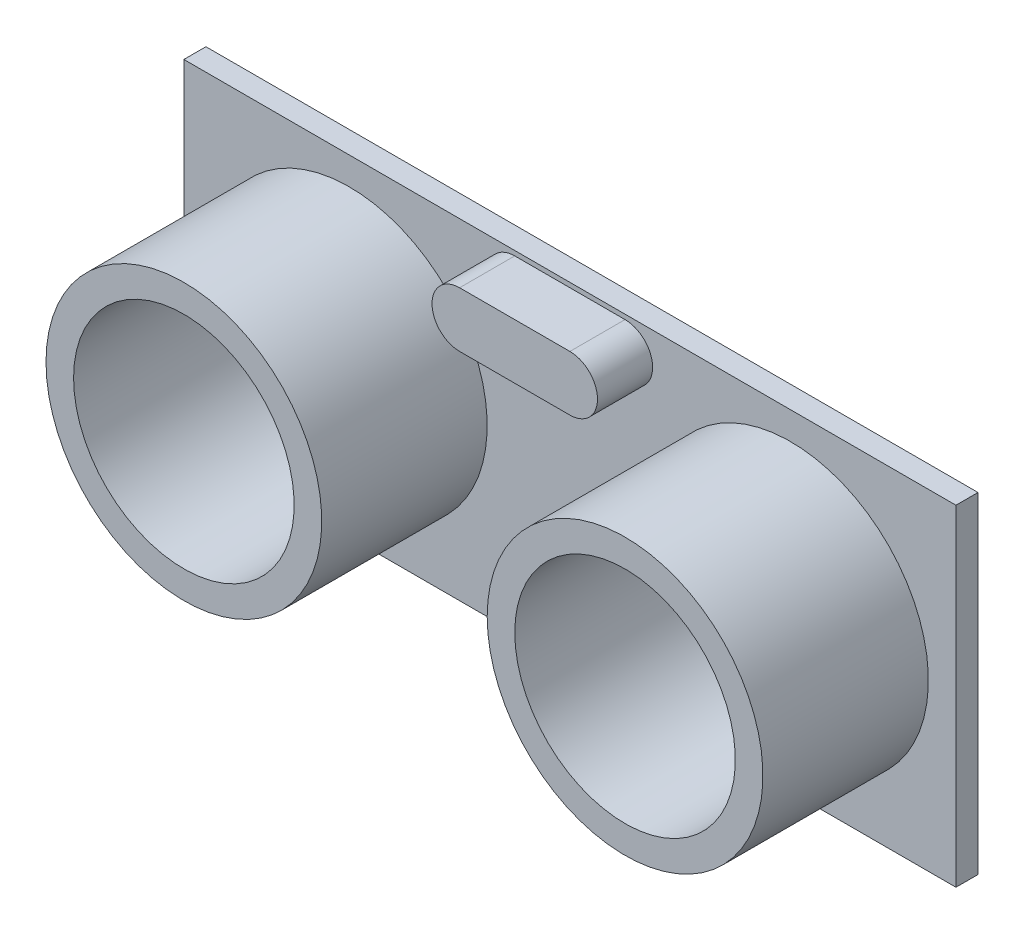
ISO-10303-21;
HEADER;
FILE_DESCRIPTION(('STEP AP214'),'2;1');
FILE_NAME('part.step','',(''),(''),'','','');
FILE_SCHEMA(('AUTOMOTIVE_DESIGN { 1 0 10303 214 1 1 1 1 }'));
ENDSEC;
DATA;
#1=APPLICATION_CONTEXT('core data for automotive mechanical design processes');
#2=APPLICATION_PROTOCOL_DEFINITION('international standard','automotive_design',2000,#1);
#3=PRODUCT_CONTEXT('',#1,'mechanical');
#4=PRODUCT('Part','Part','',(#3));
#5=PRODUCT_RELATED_PRODUCT_CATEGORY('part','',(#4));
#6=PRODUCT_DEFINITION_FORMATION('','',#4);
#7=PRODUCT_DEFINITION_CONTEXT('part definition',#1,'design');
#8=PRODUCT_DEFINITION('design','',#6,#7);
#9=PRODUCT_DEFINITION_SHAPE('','',#8);
#10=(LENGTH_UNIT() NAMED_UNIT(*) SI_UNIT(.MILLI.,.METRE.));
#11=(NAMED_UNIT(*) PLANE_ANGLE_UNIT() SI_UNIT($,.RADIAN.));
#12=(NAMED_UNIT(*) SI_UNIT($,.STERADIAN.) SOLID_ANGLE_UNIT());
#13=UNCERTAINTY_MEASURE_WITH_UNIT(LENGTH_MEASURE(1.E-05),#10,'distance_accuracy_value','');
#14=(GEOMETRIC_REPRESENTATION_CONTEXT(3) GLOBAL_UNCERTAINTY_ASSIGNED_CONTEXT((#13)) GLOBAL_UNIT_ASSIGNED_CONTEXT((#10,
#11,#12)) REPRESENTATION_CONTEXT('',''));
#15=CARTESIAN_POINT('',(0.,0.,0.));
#16=DIRECTION('',(0.,0.,1.));
#17=DIRECTION('',(1.,0.,0.));
#18=AXIS2_PLACEMENT_3D('',#15,#16,#17);
#19=CARTESIAN_POINT('',(0.,0.,1.27));
#20=DIRECTION('',(0.,0.,-1.));
#21=DIRECTION('',(-1.,0.,0.));
#22=AXIS2_PLACEMENT_3D('',#19,#20,#21);
#23=PLANE('',#22);
#24=CARTESIAN_POINT('',(12.7,0.,1.27));
#25=DIRECTION('',(0.,0.,-1.));
#26=DIRECTION('',(-1.,0.,0.));
#27=AXIS2_PLACEMENT_3D('',#24,#25,#26);
#28=CIRCLE('',#27,7.9375);
#29=CARTESIAN_POINT('',(4.7625,0.,1.27));
#30=VERTEX_POINT('',#29);
#31=EDGE_CURVE('E199',#30,#30,#28,.F.);
#32=ORIENTED_EDGE('',*,*,#31,.F.);
#33=EDGE_LOOP('',(#32));
#34=FACE_BOUND('',#33,.T.);
#35=CARTESIAN_POINT('',(-12.7,0.,1.27));
#36=DIRECTION('',(0.,0.,1.));
#37=DIRECTION('',(1.,0.,0.));
#38=AXIS2_PLACEMENT_3D('',#35,#36,#37);
#39=CIRCLE('',#38,7.9375);
#40=CARTESIAN_POINT('',(-20.6375,0.,1.27));
#41=VERTEX_POINT('',#40);
#42=EDGE_CURVE('E284',#41,#41,#39,.F.);
#43=ORIENTED_EDGE('',*,*,#42,.T.);
#44=EDGE_LOOP('',(#43));
#45=FACE_BOUND('',#44,.T.);
#46=DIRECTION('',(0.,1.,0.));
#47=VECTOR('',#46,1.);
#48=CARTESIAN_POINT('',(22.225,-9.525,1.27));
#49=LINE('',#48,#47);
#50=CARTESIAN_POINT('',(22.225,-9.525,1.27));
#51=VERTEX_POINT('',#50);
#52=CARTESIAN_POINT('',(22.225,9.525,1.27));
#53=VERTEX_POINT('',#52);
#54=EDGE_CURVE('E290',#51,#53,#49,.T.);
#55=ORIENTED_EDGE('',*,*,#54,.T.);
#56=DIRECTION('',(-1.,0.,0.));
#57=VECTOR('',#56,1.);
#58=CARTESIAN_POINT('',(-22.225,9.525,1.27));
#59=LINE('',#58,#57);
#60=CARTESIAN_POINT('',(-22.225,9.525,1.27));
#61=VERTEX_POINT('',#60);
#62=EDGE_CURVE('E293',#53,#61,#59,.T.);
#63=ORIENTED_EDGE('',*,*,#62,.T.);
#64=DIRECTION('',(0.,-1.,0.));
#65=VECTOR('',#64,1.);
#66=CARTESIAN_POINT('',(-22.225,-9.525,1.27));
#67=LINE('',#66,#65);
#68=CARTESIAN_POINT('',(-22.225,-9.525,1.27));
#69=VERTEX_POINT('',#68);
#70=EDGE_CURVE('E295',#61,#69,#67,.T.);
#71=ORIENTED_EDGE('',*,*,#70,.T.);
#72=DIRECTION('',(1.,0.,0.));
#73=VECTOR('',#72,1.);
#74=CARTESIAN_POINT('',(-22.225,-9.525,1.27));
#75=LINE('',#74,#73);
#76=EDGE_CURVE('E297',#69,#51,#75,.T.);
#77=ORIENTED_EDGE('',*,*,#76,.T.);
#78=EDGE_LOOP('',(#55,#63,#71,#77));
#79=FACE_BOUND('',#78,.T.);
#80=DIRECTION('',(1.,0.,0.));
#81=VECTOR('',#80,1.);
#82=CARTESIAN_POINT('',(0.,6.0799702041295,1.27));
#83=LINE('',#82,#81);
#84=CARTESIAN_POINT('',(-3.175,6.0799702041295,1.27));
#85=VERTEX_POINT('',#84);
#86=CARTESIAN_POINT('',(3.175,6.0799702041295,1.27));
#87=VERTEX_POINT('',#86);
#88=EDGE_CURVE('E147',#85,#87,#83,.T.);
#89=ORIENTED_EDGE('',*,*,#88,.F.);
#90=CARTESIAN_POINT('',(-3.175,7.6674702041295,1.27));
#91=DIRECTION('',(0.,0.,1.));
#92=DIRECTION('',(1.,0.,0.));
#93=AXIS2_PLACEMENT_3D('',#90,#91,#92);
#94=CIRCLE('',#93,1.5875);
#95=CARTESIAN_POINT('',(-3.175,9.2549702041295,1.27));
#96=VERTEX_POINT('',#95);
#97=EDGE_CURVE('E144',#96,#85,#94,.T.);
#98=ORIENTED_EDGE('',*,*,#97,.F.);
#99=DIRECTION('',(1.,0.,0.));
#100=VECTOR('',#99,1.);
#101=CARTESIAN_POINT('',(0.,9.2549702041295,1.27));
#102=LINE('',#101,#100);
#103=CARTESIAN_POINT('',(3.175,9.2549702041295,1.27));
#104=VERTEX_POINT('',#103);
#105=EDGE_CURVE('E57',#96,#104,#102,.T.);
#106=ORIENTED_EDGE('',*,*,#105,.T.);
#107=CARTESIAN_POINT('',(3.175,7.6674702041295,1.27));
#108=DIRECTION('',(0.,0.,1.));
#109=DIRECTION('',(1.,0.,0.));
#110=AXIS2_PLACEMENT_3D('',#107,#108,#109);
#111=CIRCLE('',#110,1.5875);
#112=EDGE_CURVE('E52',#87,#104,#111,.T.);
#113=ORIENTED_EDGE('',*,*,#112,.F.);
#114=EDGE_LOOP('',(#89,#98,#106,#113));
#115=FACE_BOUND('',#114,.T.);
#116=ADVANCED_FACE('F37',(#34,#45,#79,#115),#23,.F.);
#117=CARTESIAN_POINT('',(-22.225,-9.525,1.27));
#118=DIRECTION('',(0.,1.,0.));
#119=DIRECTION('',(0.,0.,1.));
#120=AXIS2_PLACEMENT_3D('',#117,#118,#119);
#121=PLANE('',#120);
#122=CARTESIAN_POINT('',(1.53192669237891,-9.525,-0.79375));
#123=DIRECTION('',(0.,1.,0.));
#124=DIRECTION('',(0.,0.,1.));
#125=AXIS2_PLACEMENT_3D('',#122,#123,#124);
#126=CIRCLE('',#125,0.396875);
#127=CARTESIAN_POINT('',(1.53192669237891,-9.525,-0.396875));
#128=VERTEX_POINT('',#127);
#129=EDGE_CURVE('E45',#128,#128,#126,.F.);
#130=ORIENTED_EDGE('',*,*,#129,.F.);
#131=EDGE_LOOP('',(#130));
#132=FACE_BOUND('',#131,.T.);
#133=CARTESIAN_POINT('',(-3.54807330762109,-9.525,-0.79375));
#134=DIRECTION('',(0.,1.,0.));
#135=DIRECTION('',(0.,0.,1.));
#136=AXIS2_PLACEMENT_3D('',#133,#134,#135);
#137=CIRCLE('',#136,0.396875);
#138=CARTESIAN_POINT('',(-3.54807330762109,-9.525,-0.396875));
#139=VERTEX_POINT('',#138);
#140=EDGE_CURVE('E195',#139,#139,#137,.F.);
#141=ORIENTED_EDGE('',*,*,#140,.F.);
#142=EDGE_LOOP('',(#141));
#143=FACE_BOUND('',#142,.T.);
#144=DIRECTION('',(1.,0.,0.));
#145=VECTOR('',#144,1.);
#146=CARTESIAN_POINT('',(-22.225,-9.525,0.));
#147=LINE('',#146,#145);
#148=CARTESIAN_POINT('',(-22.225,-9.525,0.));
#149=VERTEX_POINT('',#148);
#150=CARTESIAN_POINT('',(-4.67301013825087,-9.525,0.));
#151=VERTEX_POINT('',#150);
#152=EDGE_CURVE('E217',#149,#151,#147,.T.);
#153=ORIENTED_EDGE('',*,*,#152,.T.);
#154=DIRECTION('',(0.,0.,1.));
#155=VECTOR('',#154,1.);
#156=CARTESIAN_POINT('',(-4.67301013825087,-9.525,-1.5875));
#157=LINE('',#156,#155);
#158=CARTESIAN_POINT('',(-4.67301013825087,-9.525,-1.5875));
#159=VERTEX_POINT('',#158);
#160=EDGE_CURVE('E176',#159,#151,#157,.T.);
#161=ORIENTED_EDGE('',*,*,#160,.F.);
#162=DIRECTION('',(-1.,0.,0.));
#163=VECTOR('',#162,1.);
#164=CARTESIAN_POINT('',(4.85198986174913,-9.525,-1.5875));
#165=LINE('',#164,#163);
#166=CARTESIAN_POINT('',(4.85198986174913,-9.525,-1.5875));
#167=VERTEX_POINT('',#166);
#168=EDGE_CURVE('E174',#167,#159,#165,.T.);
#169=ORIENTED_EDGE('',*,*,#168,.F.);
#170=DIRECTION('',(0.,0.,1.));
#171=VECTOR('',#170,1.);
#172=CARTESIAN_POINT('',(4.85198986174913,-9.525,-1.5875));
#173=LINE('',#172,#171);
#174=CARTESIAN_POINT('',(4.85198986174913,-9.525,0.));
#175=VERTEX_POINT('',#174);
#176=EDGE_CURVE('E190',#167,#175,#173,.T.);
#177=ORIENTED_EDGE('',*,*,#176,.T.);
#178=CARTESIAN_POINT('',(22.225,-9.525,0.));
#179=VERTEX_POINT('',#178);
#180=EDGE_CURVE('E306',#175,#179,#147,.T.);
#181=ORIENTED_EDGE('',*,*,#180,.T.);
#182=DIRECTION('',(0.,0.,-1.));
#183=VECTOR('',#182,1.);
#184=CARTESIAN_POINT('',(22.225,-9.525,1.27));
#185=LINE('',#184,#183);
#186=EDGE_CURVE('E299',#51,#179,#185,.T.);
#187=ORIENTED_EDGE('',*,*,#186,.F.);
#188=ORIENTED_EDGE('',*,*,#76,.F.);
#189=DIRECTION('',(0.,0.,-1.));
#190=VECTOR('',#189,1.);
#191=CARTESIAN_POINT('',(-22.225,-9.525,1.27));
#192=LINE('',#191,#190);
#193=EDGE_CURVE('E325',#69,#149,#192,.T.);
#194=ORIENTED_EDGE('',*,*,#193,.T.);
#195=EDGE_LOOP('',(#153,#161,#169,#177,#181,#187,#188,#194));
#196=FACE_BOUND('',#195,.T.);
#197=CARTESIAN_POINT('',(-1.00807330762109,-9.525,-0.79375));
#198=DIRECTION('',(0.,1.,0.));
#199=DIRECTION('',(0.,0.,1.));
#200=AXIS2_PLACEMENT_3D('',#197,#198,#199);
#201=CIRCLE('',#200,0.396875);
#202=CARTESIAN_POINT('',(-1.00807330762109,-9.525,-0.396875));
#203=VERTEX_POINT('',#202);
#204=EDGE_CURVE('E198',#203,#203,#201,.F.);
#205=ORIENTED_EDGE('',*,*,#204,.F.);
#206=EDGE_LOOP('',(#205));
#207=FACE_BOUND('',#206,.T.);
#208=CARTESIAN_POINT('',(4.0719266923789,-9.525,-0.79375));
#209=DIRECTION('',(0.,1.,0.));
#210=DIRECTION('',(0.,0.,1.));
#211=AXIS2_PLACEMENT_3D('',#208,#209,#210);
#212=CIRCLE('',#211,0.396875);
#213=CARTESIAN_POINT('',(4.0719266923789,-9.525,-0.396875));
#214=VERTEX_POINT('',#213);
#215=EDGE_CURVE('E11',#214,#214,#212,.F.);
#216=ORIENTED_EDGE('',*,*,#215,.F.);
#217=EDGE_LOOP('',(#216));
#218=FACE_BOUND('',#217,.T.);
#219=ADVANCED_FACE('F206',(#132,#143,#196,#207,#218),#121,.F.);
#220=CARTESIAN_POINT('',(22.225,-9.525,1.27));
#221=DIRECTION('',(-1.,0.,0.));
#222=DIRECTION('',(0.,0.,1.));
#223=AXIS2_PLACEMENT_3D('',#220,#221,#222);
#224=PLANE('',#223);
#225=DIRECTION('',(0.,1.,0.));
#226=VECTOR('',#225,1.);
#227=CARTESIAN_POINT('',(22.225,-9.525,0.));
#228=LINE('',#227,#226);
#229=CARTESIAN_POINT('',(22.225,9.525,0.));
#230=VERTEX_POINT('',#229);
#231=EDGE_CURVE('E287',#179,#230,#228,.T.);
#232=ORIENTED_EDGE('',*,*,#231,.T.);
#233=DIRECTION('',(0.,0.,-1.));
#234=VECTOR('',#233,1.);
#235=CARTESIAN_POINT('',(22.225,9.525,1.27));
#236=LINE('',#235,#234);
#237=EDGE_CURVE('E320',#53,#230,#236,.T.);
#238=ORIENTED_EDGE('',*,*,#237,.F.);
#239=ORIENTED_EDGE('',*,*,#54,.F.);
#240=ORIENTED_EDGE('',*,*,#186,.T.);
#241=EDGE_LOOP('',(#232,#238,#239,#240));
#242=FACE_BOUND('',#241,.T.);
#243=ADVANCED_FACE('F39',(#242),#224,.F.);
#244=CARTESIAN_POINT('',(-22.225,9.525,1.27));
#245=DIRECTION('',(0.,-1.,0.));
#246=DIRECTION('',(0.,0.,-1.));
#247=AXIS2_PLACEMENT_3D('',#244,#245,#246);
#248=PLANE('',#247);
#249=DIRECTION('',(-1.,0.,0.));
#250=VECTOR('',#249,1.);
#251=CARTESIAN_POINT('',(-22.225,9.525,0.));
#252=LINE('',#251,#250);
#253=CARTESIAN_POINT('',(-22.225,9.525,0.));
#254=VERTEX_POINT('',#253);
#255=EDGE_CURVE('E302',#230,#254,#252,.T.);
#256=ORIENTED_EDGE('',*,*,#255,.T.);
#257=DIRECTION('',(0.,0.,-1.));
#258=VECTOR('',#257,1.);
#259=CARTESIAN_POINT('',(-22.225,9.525,1.27));
#260=LINE('',#259,#258);
#261=EDGE_CURVE('E323',#61,#254,#260,.T.);
#262=ORIENTED_EDGE('',*,*,#261,.F.);
#263=ORIENTED_EDGE('',*,*,#62,.F.);
#264=ORIENTED_EDGE('',*,*,#237,.T.);
#265=EDGE_LOOP('',(#256,#262,#263,#264));
#266=FACE_BOUND('',#265,.T.);
#267=ADVANCED_FACE('F339',(#266),#248,.F.);
#268=CARTESIAN_POINT('',(-22.225,-9.525,1.27));
#269=DIRECTION('',(1.,0.,0.));
#270=DIRECTION('',(0.,0.,-1.));
#271=AXIS2_PLACEMENT_3D('',#268,#269,#270);
#272=PLANE('',#271);
#273=DIRECTION('',(0.,-1.,0.));
#274=VECTOR('',#273,1.);
#275=CARTESIAN_POINT('',(-22.225,-9.525,0.));
#276=LINE('',#275,#274);
#277=EDGE_CURVE('E304',#254,#149,#276,.T.);
#278=ORIENTED_EDGE('',*,*,#277,.T.);
#279=ORIENTED_EDGE('',*,*,#193,.F.);
#280=ORIENTED_EDGE('',*,*,#70,.F.);
#281=ORIENTED_EDGE('',*,*,#261,.T.);
#282=EDGE_LOOP('',(#278,#279,#280,#281));
#283=FACE_BOUND('',#282,.T.);
#284=ADVANCED_FACE('F343',(#283),#272,.F.);
#285=CARTESIAN_POINT('',(0.,0.,0.));
#286=DIRECTION('',(0.,0.,-1.));
#287=DIRECTION('',(-1.,0.,0.));
#288=AXIS2_PLACEMENT_3D('',#285,#286,#287);
#289=PLANE('',#288);
#290=DIRECTION('',(0.,1.,0.));
#291=VECTOR('',#290,1.);
#292=CARTESIAN_POINT('',(-4.67301013825087,-7.9375,0.));
#293=LINE('',#292,#291);
#294=CARTESIAN_POINT('',(-4.67301013825087,-7.9375,0.));
#295=VERTEX_POINT('',#294);
#296=EDGE_CURVE('E165',#151,#295,#293,.T.);
#297=ORIENTED_EDGE('',*,*,#296,.F.);
#298=ORIENTED_EDGE('',*,*,#152,.F.);
#299=ORIENTED_EDGE('',*,*,#277,.F.);
#300=ORIENTED_EDGE('',*,*,#255,.F.);
#301=ORIENTED_EDGE('',*,*,#231,.F.);
#302=ORIENTED_EDGE('',*,*,#180,.F.);
#303=DIRECTION('',(0.,-1.,0.));
#304=VECTOR('',#303,1.);
#305=CARTESIAN_POINT('',(4.85198986174913,-7.9375,0.));
#306=LINE('',#305,#304);
#307=CARTESIAN_POINT('',(4.85198986174913,-7.9375,0.));
#308=VERTEX_POINT('',#307);
#309=EDGE_CURVE('E170',#308,#175,#306,.T.);
#310=ORIENTED_EDGE('',*,*,#309,.F.);
#311=DIRECTION('',(1.,0.,0.));
#312=VECTOR('',#311,1.);
#313=CARTESIAN_POINT('',(4.85198986174913,-7.9375,0.));
#314=LINE('',#313,#312);
#315=EDGE_CURVE('E177',#295,#308,#314,.T.);
#316=ORIENTED_EDGE('',*,*,#315,.F.);
#317=EDGE_LOOP('',(#297,#298,#299,#300,#301,#302,#310,#316));
#318=FACE_BOUND('',#317,.T.);
#319=ADVANCED_FACE('F335',(#318),#289,.T.);
#320=CARTESIAN_POINT('',(-12.7,0.,10.795));
#321=DIRECTION('',(0.,0.,-1.));
#322=DIRECTION('',(-1.,0.,0.));
#323=AXIS2_PLACEMENT_3D('',#320,#321,#322);
#324=CYLINDRICAL_SURFACE('',#323,7.9375);
#325=CARTESIAN_POINT('',(-12.7,0.,10.795));
#326=DIRECTION('',(0.,0.,1.));
#327=DIRECTION('',(1.,0.,0.));
#328=AXIS2_PLACEMENT_3D('',#325,#326,#327);
#329=CIRCLE('',#328,7.9375);
#330=CARTESIAN_POINT('',(-20.6375,0.,10.795));
#331=VERTEX_POINT('',#330);
#332=EDGE_CURVE('E280',#331,#331,#329,.F.);
#333=CARTESIAN_POINT('',(-20.6375,0.,10.795));
#334=CARTESIAN_POINT('',(-20.6375,0.,10.69578125));
#335=CARTESIAN_POINT('',(-20.6375,0.,10.5965625));
#336=CARTESIAN_POINT('',(-20.6375,0.,10.398125));
#337=CARTESIAN_POINT('',(-20.6375,0.,10.29890625));
#338=CARTESIAN_POINT('',(-20.6375,0.,10.10046875));
#339=CARTESIAN_POINT('',(-20.6375,0.,10.00125));
#340=CARTESIAN_POINT('',(-20.6375,0.,9.8028125));
#341=CARTESIAN_POINT('',(-20.6375,0.,9.70359375));
#342=CARTESIAN_POINT('',(-20.6375,0.,9.50515625));
#343=CARTESIAN_POINT('',(-20.6375,0.,9.4059375));
#344=CARTESIAN_POINT('',(-20.6375,0.,9.2075));
#345=CARTESIAN_POINT('',(-20.6375,0.,9.10828125));
#346=CARTESIAN_POINT('',(-20.6375,0.,8.90984375));
#347=CARTESIAN_POINT('',(-20.6375,0.,8.810625));
#348=CARTESIAN_POINT('',(-20.6375,0.,8.6121875));
#349=CARTESIAN_POINT('',(-20.6375,0.,8.51296875));
#350=CARTESIAN_POINT('',(-20.6375,0.,8.31453125));
#351=CARTESIAN_POINT('',(-20.6375,0.,8.2153125));
#352=CARTESIAN_POINT('',(-20.6375,0.,8.016875));
#353=CARTESIAN_POINT('',(-20.6375,0.,7.91765625));
#354=CARTESIAN_POINT('',(-20.6375,0.,7.71921875));
#355=CARTESIAN_POINT('',(-20.6375,0.,7.62));
#356=CARTESIAN_POINT('',(-20.6375,0.,7.4215625));
#357=CARTESIAN_POINT('',(-20.6375,0.,7.32234375));
#358=CARTESIAN_POINT('',(-20.6375,0.,7.12390625));
#359=CARTESIAN_POINT('',(-20.6375,0.,7.0246875));
#360=CARTESIAN_POINT('',(-20.6375,0.,6.82625));
#361=CARTESIAN_POINT('',(-20.6375,0.,6.72703125));
#362=CARTESIAN_POINT('',(-20.6375,0.,6.52859375));
#363=CARTESIAN_POINT('',(-20.6375,0.,6.429375));
#364=CARTESIAN_POINT('',(-20.6375,0.,6.2309375));
#365=CARTESIAN_POINT('',(-20.6375,0.,6.13171875));
#366=CARTESIAN_POINT('',(-20.6375,0.,5.93328125));
#367=CARTESIAN_POINT('',(-20.6375,0.,5.8340625));
#368=CARTESIAN_POINT('',(-20.6375,0.,5.635625));
#369=CARTESIAN_POINT('',(-20.6375,0.,5.53640625));
#370=CARTESIAN_POINT('',(-20.6375,0.,5.33796875));
#371=CARTESIAN_POINT('',(-20.6375,0.,5.23875));
#372=CARTESIAN_POINT('',(-20.6375,0.,5.0403125));
#373=CARTESIAN_POINT('',(-20.6375,0.,4.94109375));
#374=CARTESIAN_POINT('',(-20.6375,0.,4.74265625));
#375=CARTESIAN_POINT('',(-20.6375,0.,4.6434375));
#376=CARTESIAN_POINT('',(-20.6375,0.,4.445));
#377=CARTESIAN_POINT('',(-20.6375,0.,4.34578125));
#378=CARTESIAN_POINT('',(-20.6375,0.,4.14734375));
#379=CARTESIAN_POINT('',(-20.6375,0.,4.048125));
#380=CARTESIAN_POINT('',(-20.6375,0.,3.8496875));
#381=CARTESIAN_POINT('',(-20.6375,0.,3.75046875));
#382=CARTESIAN_POINT('',(-20.6375,0.,3.55203125));
#383=CARTESIAN_POINT('',(-20.6375,0.,3.4528125));
#384=CARTESIAN_POINT('',(-20.6375,0.,3.254375));
#385=CARTESIAN_POINT('',(-20.6375,0.,3.15515625));
#386=CARTESIAN_POINT('',(-20.6375,0.,2.95671875));
#387=CARTESIAN_POINT('',(-20.6375,0.,2.8575));
#388=CARTESIAN_POINT('',(-20.6375,0.,2.6590625));
#389=CARTESIAN_POINT('',(-20.6375,0.,2.55984375));
#390=CARTESIAN_POINT('',(-20.6375,0.,2.36140625));
#391=CARTESIAN_POINT('',(-20.6375,0.,2.2621875));
#392=CARTESIAN_POINT('',(-20.6375,0.,2.06375));
#393=CARTESIAN_POINT('',(-20.6375,0.,1.96453125));
#394=CARTESIAN_POINT('',(-20.6375,0.,1.76609375));
#395=CARTESIAN_POINT('',(-20.6375,0.,1.666875));
#396=CARTESIAN_POINT('',(-20.6375,0.,1.4684375));
#397=CARTESIAN_POINT('',(-20.6375,0.,1.36921875));
#398=CARTESIAN_POINT('',(-20.6375,0.,1.27));
#399=B_SPLINE_CURVE_WITH_KNOTS('',3,(#333,#334,#335,#336,#337,#338,#339,#340,#341,#342,#343,
#344,#345,#346,#347,#348,#349,#350,#351,#352,#353,#354,#355,#356,#357,#358,#359,#360,#361,#362,
#363,#364,#365,#366,#367,#368,#369,#370,#371,#372,#373,#374,#375,#376,#377,#378,#379,#380,#381,
#382,#383,#384,#385,#386,#387,#388,#389,#390,#391,#392,#393,#394,#395,#396,#397,#398),
.UNSPECIFIED.,.F.,.F.,(4,2,2,2,2,2,2,2,2,2,2,2,2,2,2,2,2,2,2,2,2,2,2,2,2,2,2,2,2,2,2,2,4),(0.,
0.297656249999998,0.595312499999999,0.892968749999999,1.190625,1.48828125,1.7859375,2.08359375,
2.38125,2.67890625,2.9765625,3.27421875,3.571875,3.86953125,4.1671875,4.46484375,4.7625,
5.06015625,5.3578125,5.65546875,5.953125,6.25078125,6.5484375,6.84609375,7.14375,7.44140625,
7.7390625,8.03671875,8.334375,8.63203125,8.9296875,9.22734375,9.525),.UNSPECIFIED.);
#400=EDGE_CURVE('BSEAM350',#331,#41,#399,.T.);
#401=ORIENTED_EDGE('',*,*,#332,.T.);
#402=ORIENTED_EDGE('',*,*,#42,.F.);
#403=ORIENTED_EDGE('',*,*,#400,.T.);
#404=ORIENTED_EDGE('',*,*,#400,.F.);
#405=EDGE_LOOP('',(#401,#403,#402,#404));
#406=FACE_BOUND('',#405,.T.);
#407=ADVANCED_FACE('F350',(#406),#324,.T.);
#408=CARTESIAN_POINT('',(-12.7,0.,10.795));
#409=DIRECTION('',(0.,0.,-1.));
#410=DIRECTION('',(-1.,0.,0.));
#411=AXIS2_PLACEMENT_3D('',#408,#409,#410);
#412=CYLINDRICAL_SURFACE('',#411,6.35);
#413=CARTESIAN_POINT('',(-12.7,0.,10.795));
#414=DIRECTION('',(0.,0.,1.));
#415=DIRECTION('',(1.,0.,0.));
#416=AXIS2_PLACEMENT_3D('',#413,#414,#415);
#417=CIRCLE('',#416,6.35);
#418=CARTESIAN_POINT('',(-19.05,0.,10.795));
#419=VERTEX_POINT('',#418);
#420=EDGE_CURVE('E283',#419,#419,#417,.F.);
#421=CARTESIAN_POINT('',(-12.7,0.,1.27));
#422=DIRECTION('',(0.,0.,-1.));
#423=DIRECTION('',(-1.,0.,0.));
#424=AXIS2_PLACEMENT_3D('',#421,#422,#423);
#425=CIRCLE('',#424,6.35);
#426=CARTESIAN_POINT('',(-19.05,0.,1.27));
#427=VERTEX_POINT('',#426);
#428=EDGE_CURVE('E317',#427,#427,#425,.T.);
#429=CARTESIAN_POINT('',(-19.05,0.,10.795));
#430=CARTESIAN_POINT('',(-19.05,0.,10.69578125));
#431=CARTESIAN_POINT('',(-19.05,0.,10.5965625));
#432=CARTESIAN_POINT('',(-19.05,0.,10.398125));
#433=CARTESIAN_POINT('',(-19.05,0.,10.29890625));
#434=CARTESIAN_POINT('',(-19.05,0.,10.10046875));
#435=CARTESIAN_POINT('',(-19.05,0.,10.00125));
#436=CARTESIAN_POINT('',(-19.05,0.,9.8028125));
#437=CARTESIAN_POINT('',(-19.05,0.,9.70359375));
#438=CARTESIAN_POINT('',(-19.05,0.,9.50515625));
#439=CARTESIAN_POINT('',(-19.05,0.,9.4059375));
#440=CARTESIAN_POINT('',(-19.05,0.,9.2075));
#441=CARTESIAN_POINT('',(-19.05,0.,9.10828125));
#442=CARTESIAN_POINT('',(-19.05,0.,8.90984375));
#443=CARTESIAN_POINT('',(-19.05,0.,8.810625));
#444=CARTESIAN_POINT('',(-19.05,0.,8.6121875));
#445=CARTESIAN_POINT('',(-19.05,0.,8.51296875));
#446=CARTESIAN_POINT('',(-19.05,0.,8.31453125));
#447=CARTESIAN_POINT('',(-19.05,0.,8.2153125));
#448=CARTESIAN_POINT('',(-19.05,0.,8.016875));
#449=CARTESIAN_POINT('',(-19.05,0.,7.91765625));
#450=CARTESIAN_POINT('',(-19.05,0.,7.71921875));
#451=CARTESIAN_POINT('',(-19.05,0.,7.62));
#452=CARTESIAN_POINT('',(-19.05,0.,7.4215625));
#453=CARTESIAN_POINT('',(-19.05,0.,7.32234375));
#454=CARTESIAN_POINT('',(-19.05,0.,7.12390625));
#455=CARTESIAN_POINT('',(-19.05,0.,7.0246875));
#456=CARTESIAN_POINT('',(-19.05,0.,6.82625));
#457=CARTESIAN_POINT('',(-19.05,0.,6.72703125));
#458=CARTESIAN_POINT('',(-19.05,0.,6.52859375));
#459=CARTESIAN_POINT('',(-19.05,0.,6.429375));
#460=CARTESIAN_POINT('',(-19.05,0.,6.2309375));
#461=CARTESIAN_POINT('',(-19.05,0.,6.13171875));
#462=CARTESIAN_POINT('',(-19.05,0.,5.93328125));
#463=CARTESIAN_POINT('',(-19.05,0.,5.8340625));
#464=CARTESIAN_POINT('',(-19.05,0.,5.635625));
#465=CARTESIAN_POINT('',(-19.05,0.,5.53640625));
#466=CARTESIAN_POINT('',(-19.05,0.,5.33796875));
#467=CARTESIAN_POINT('',(-19.05,0.,5.23875));
#468=CARTESIAN_POINT('',(-19.05,0.,5.0403125));
#469=CARTESIAN_POINT('',(-19.05,0.,4.94109375));
#470=CARTESIAN_POINT('',(-19.05,0.,4.74265625));
#471=CARTESIAN_POINT('',(-19.05,0.,4.6434375));
#472=CARTESIAN_POINT('',(-19.05,0.,4.445));
#473=CARTESIAN_POINT('',(-19.05,0.,4.34578125));
#474=CARTESIAN_POINT('',(-19.05,0.,4.14734375));
#475=CARTESIAN_POINT('',(-19.05,0.,4.048125));
#476=CARTESIAN_POINT('',(-19.05,0.,3.8496875));
#477=CARTESIAN_POINT('',(-19.05,0.,3.75046875));
#478=CARTESIAN_POINT('',(-19.05,0.,3.55203125));
#479=CARTESIAN_POINT('',(-19.05,0.,3.4528125));
#480=CARTESIAN_POINT('',(-19.05,0.,3.254375));
#481=CARTESIAN_POINT('',(-19.05,0.,3.15515625));
#482=CARTESIAN_POINT('',(-19.05,0.,2.95671875));
#483=CARTESIAN_POINT('',(-19.05,0.,2.8575));
#484=CARTESIAN_POINT('',(-19.05,0.,2.6590625));
#485=CARTESIAN_POINT('',(-19.05,0.,2.55984375));
#486=CARTESIAN_POINT('',(-19.05,0.,2.36140625));
#487=CARTESIAN_POINT('',(-19.05,0.,2.2621875));
#488=CARTESIAN_POINT('',(-19.05,0.,2.06375));
#489=CARTESIAN_POINT('',(-19.05,0.,1.96453125));
#490=CARTESIAN_POINT('',(-19.05,0.,1.76609375));
#491=CARTESIAN_POINT('',(-19.05,0.,1.666875));
#492=CARTESIAN_POINT('',(-19.05,0.,1.4684375));
#493=CARTESIAN_POINT('',(-19.05,0.,1.36921875));
#494=CARTESIAN_POINT('',(-19.05,0.,1.27));
#495=B_SPLINE_CURVE_WITH_KNOTS('',3,(#429,#430,#431,#432,#433,#434,#435,#436,#437,#438,#439,
#440,#441,#442,#443,#444,#445,#446,#447,#448,#449,#450,#451,#452,#453,#454,#455,#456,#457,#458,
#459,#460,#461,#462,#463,#464,#465,#466,#467,#468,#469,#470,#471,#472,#473,#474,#475,#476,#477,
#478,#479,#480,#481,#482,#483,#484,#485,#486,#487,#488,#489,#490,#491,#492,#493,#494),
.UNSPECIFIED.,.F.,.F.,(4,2,2,2,2,2,2,2,2,2,2,2,2,2,2,2,2,2,2,2,2,2,2,2,2,2,2,2,2,2,2,2,4),(0.,
0.297656249999998,0.595312499999999,0.892968749999999,1.190625,1.48828125,1.7859375,2.08359375,
2.38125,2.67890625,2.9765625,3.27421875,3.571875,3.86953125,4.1671875,4.46484375,4.7625,
5.06015625,5.3578125,5.65546875,5.953125,6.25078125,6.5484375,6.84609375,7.14375,7.44140625,
7.7390625,8.03671875,8.334375,8.63203125,8.9296875,9.22734375,9.525),.UNSPECIFIED.);
#496=EDGE_CURVE('BSEAM516',#419,#427,#495,.T.);
#497=ORIENTED_EDGE('',*,*,#420,.F.);
#498=ORIENTED_EDGE('',*,*,#428,.T.);
#499=ORIENTED_EDGE('',*,*,#496,.T.);
#500=ORIENTED_EDGE('',*,*,#496,.F.);
#501=EDGE_LOOP('',(#497,#499,#498,#500));
#502=FACE_BOUND('',#501,.T.);
#503=ADVANCED_FACE('F516',(#502),#412,.F.);
#504=CARTESIAN_POINT('',(0.,0.,10.795));
#505=DIRECTION('',(0.,0.,1.));
#506=DIRECTION('',(1.,0.,0.));
#507=AXIS2_PLACEMENT_3D('',#504,#505,#506);
#508=PLANE('',#507);
#509=ORIENTED_EDGE('',*,*,#332,.F.);
#510=EDGE_LOOP('',(#509));
#511=FACE_BOUND('',#510,.T.);
#512=ORIENTED_EDGE('',*,*,#420,.T.);
#513=EDGE_LOOP('',(#512));
#514=FACE_BOUND('',#513,.T.);
#515=ADVANCED_FACE('F251',(#511,#514),#508,.T.);
#516=ORIENTED_EDGE('',*,*,#428,.F.);
#517=EDGE_LOOP('',(#516));
#518=FACE_BOUND('',#517,.T.);
#519=ADVANCED_FACE('F241',(#518),#23,.F.);
#520=CARTESIAN_POINT('',(12.7,0.,10.795));
#521=DIRECTION('',(0.,0.,-1.));
#522=DIRECTION('',(-1.,0.,0.));
#523=AXIS2_PLACEMENT_3D('',#520,#521,#522);
#524=CYLINDRICAL_SURFACE('',#523,6.35);
#525=CARTESIAN_POINT('',(12.7,0.,10.795));
#526=DIRECTION('',(0.,0.,1.));
#527=DIRECTION('',(1.,0.,0.));
#528=AXIS2_PLACEMENT_3D('',#525,#526,#527);
#529=CIRCLE('',#528,6.35);
#530=CARTESIAN_POINT('',(6.35,0.,10.795));
#531=VERTEX_POINT('',#530);
#532=EDGE_CURVE('E271',#531,#531,#529,.T.);
#533=CARTESIAN_POINT('',(12.7,0.,1.27));
#534=DIRECTION('',(0.,0.,1.));
#535=DIRECTION('',(1.,0.,0.));
#536=AXIS2_PLACEMENT_3D('',#533,#534,#535);
#537=CIRCLE('',#536,6.35);
#538=CARTESIAN_POINT('',(6.35,0.,1.27));
#539=VERTEX_POINT('',#538);
#540=EDGE_CURVE('E269',#539,#539,#537,.T.);
#541=CARTESIAN_POINT('',(6.35,0.,10.795));
#542=CARTESIAN_POINT('',(6.35,0.,10.69578125));
#543=CARTESIAN_POINT('',(6.35,0.,10.5965625));
#544=CARTESIAN_POINT('',(6.35,0.,10.398125));
#545=CARTESIAN_POINT('',(6.35,0.,10.29890625));
#546=CARTESIAN_POINT('',(6.35,0.,10.10046875));
#547=CARTESIAN_POINT('',(6.35,0.,10.00125));
#548=CARTESIAN_POINT('',(6.35,0.,9.8028125));
#549=CARTESIAN_POINT('',(6.35,0.,9.70359375));
#550=CARTESIAN_POINT('',(6.35,0.,9.50515625));
#551=CARTESIAN_POINT('',(6.35,0.,9.4059375));
#552=CARTESIAN_POINT('',(6.35,0.,9.2075));
#553=CARTESIAN_POINT('',(6.35,0.,9.10828125));
#554=CARTESIAN_POINT('',(6.35,0.,8.90984375));
#555=CARTESIAN_POINT('',(6.35,0.,8.810625));
#556=CARTESIAN_POINT('',(6.35,0.,8.6121875));
#557=CARTESIAN_POINT('',(6.35,0.,8.51296875));
#558=CARTESIAN_POINT('',(6.35,0.,8.31453125));
#559=CARTESIAN_POINT('',(6.35,0.,8.2153125));
#560=CARTESIAN_POINT('',(6.35,0.,8.016875));
#561=CARTESIAN_POINT('',(6.35,0.,7.91765625));
#562=CARTESIAN_POINT('',(6.35,0.,7.71921875));
#563=CARTESIAN_POINT('',(6.35,0.,7.62));
#564=CARTESIAN_POINT('',(6.35,0.,7.4215625));
#565=CARTESIAN_POINT('',(6.35,0.,7.32234375));
#566=CARTESIAN_POINT('',(6.35,0.,7.12390625));
#567=CARTESIAN_POINT('',(6.35,0.,7.0246875));
#568=CARTESIAN_POINT('',(6.35,0.,6.82625));
#569=CARTESIAN_POINT('',(6.35,0.,6.72703125));
#570=CARTESIAN_POINT('',(6.35,0.,6.52859375));
#571=CARTESIAN_POINT('',(6.35,0.,6.429375));
#572=CARTESIAN_POINT('',(6.35,0.,6.2309375));
#573=CARTESIAN_POINT('',(6.35,0.,6.13171875));
#574=CARTESIAN_POINT('',(6.35,0.,5.93328125));
#575=CARTESIAN_POINT('',(6.35,0.,5.8340625));
#576=CARTESIAN_POINT('',(6.35,0.,5.635625));
#577=CARTESIAN_POINT('',(6.35,0.,5.53640625));
#578=CARTESIAN_POINT('',(6.35,0.,5.33796875));
#579=CARTESIAN_POINT('',(6.35,0.,5.23875));
#580=CARTESIAN_POINT('',(6.35,0.,5.0403125));
#581=CARTESIAN_POINT('',(6.35,0.,4.94109375));
#582=CARTESIAN_POINT('',(6.35,0.,4.74265625));
#583=CARTESIAN_POINT('',(6.35,0.,4.6434375));
#584=CARTESIAN_POINT('',(6.35,0.,4.445));
#585=CARTESIAN_POINT('',(6.35,0.,4.34578125));
#586=CARTESIAN_POINT('',(6.35,0.,4.14734375));
#587=CARTESIAN_POINT('',(6.35,0.,4.048125));
#588=CARTESIAN_POINT('',(6.35,0.,3.8496875));
#589=CARTESIAN_POINT('',(6.35,0.,3.75046875));
#590=CARTESIAN_POINT('',(6.35,0.,3.55203125));
#591=CARTESIAN_POINT('',(6.35,0.,3.4528125));
#592=CARTESIAN_POINT('',(6.35,0.,3.254375));
#593=CARTESIAN_POINT('',(6.35,0.,3.15515625));
#594=CARTESIAN_POINT('',(6.35,0.,2.95671875));
#595=CARTESIAN_POINT('',(6.35,0.,2.8575));
#596=CARTESIAN_POINT('',(6.35,0.,2.6590625));
#597=CARTESIAN_POINT('',(6.35,0.,2.55984375));
#598=CARTESIAN_POINT('',(6.35,0.,2.36140625));
#599=CARTESIAN_POINT('',(6.35,0.,2.2621875));
#600=CARTESIAN_POINT('',(6.35,0.,2.06375));
#601=CARTESIAN_POINT('',(6.35,0.,1.96453125));
#602=CARTESIAN_POINT('',(6.35,0.,1.76609375));
#603=CARTESIAN_POINT('',(6.35,0.,1.666875));
#604=CARTESIAN_POINT('',(6.35,0.,1.4684375));
#605=CARTESIAN_POINT('',(6.35,0.,1.36921875));
#606=CARTESIAN_POINT('',(6.35,0.,1.27));
#607=B_SPLINE_CURVE_WITH_KNOTS('',3,(#541,#542,#543,#544,#545,#546,#547,#548,#549,#550,#551,
#552,#553,#554,#555,#556,#557,#558,#559,#560,#561,#562,#563,#564,#565,#566,#567,#568,#569,#570,
#571,#572,#573,#574,#575,#576,#577,#578,#579,#580,#581,#582,#583,#584,#585,#586,#587,#588,#589,
#590,#591,#592,#593,#594,#595,#596,#597,#598,#599,#600,#601,#602,#603,#604,#605,#606),
.UNSPECIFIED.,.F.,.F.,(4,2,2,2,2,2,2,2,2,2,2,2,2,2,2,2,2,2,2,2,2,2,2,2,2,2,2,2,2,2,2,2,4),(0.,
0.297656249999998,0.595312499999999,0.892968749999999,1.190625,1.48828125,1.7859375,2.08359375,
2.38125,2.67890625,2.9765625,3.27421875,3.571875,3.86953125,4.1671875,4.46484375,4.7625,
5.06015625,5.3578125,5.65546875,5.953125,6.25078125,6.5484375,6.84609375,7.14375,7.44140625,
7.7390625,8.03671875,8.334375,8.63203125,8.9296875,9.22734375,9.525),.UNSPECIFIED.);
#608=EDGE_CURVE('BSEAM250',#531,#539,#607,.T.);
#609=ORIENTED_EDGE('',*,*,#532,.T.);
#610=ORIENTED_EDGE('',*,*,#540,.F.);
#611=ORIENTED_EDGE('',*,*,#608,.T.);
#612=ORIENTED_EDGE('',*,*,#608,.F.);
#613=EDGE_LOOP('',(#609,#611,#610,#612));
#614=FACE_BOUND('',#613,.T.);
#615=ADVANCED_FACE('F250',(#614),#524,.F.);
#616=CARTESIAN_POINT('',(12.7,0.,10.795));
#617=DIRECTION('',(0.,0.,-1.));
#618=DIRECTION('',(-1.,0.,0.));
#619=AXIS2_PLACEMENT_3D('',#616,#617,#618);
#620=CYLINDRICAL_SURFACE('',#619,7.9375);
#621=CARTESIAN_POINT('',(12.7,0.,10.795));
#622=DIRECTION('',(0.,0.,1.));
#623=DIRECTION('',(1.,0.,0.));
#624=AXIS2_PLACEMENT_3D('',#621,#622,#623);
#625=CIRCLE('',#624,7.9375);
#626=CARTESIAN_POINT('',(4.7625,0.,10.795));
#627=VERTEX_POINT('',#626);
#628=EDGE_CURVE('E275',#627,#627,#625,.T.);
#629=CARTESIAN_POINT('',(4.7625,0.,10.795));
#630=CARTESIAN_POINT('',(4.7625,0.,10.69578125));
#631=CARTESIAN_POINT('',(4.7625,0.,10.5965625));
#632=CARTESIAN_POINT('',(4.7625,0.,10.398125));
#633=CARTESIAN_POINT('',(4.7625,0.,10.29890625));
#634=CARTESIAN_POINT('',(4.7625,0.,10.10046875));
#635=CARTESIAN_POINT('',(4.7625,0.,10.00125));
#636=CARTESIAN_POINT('',(4.7625,0.,9.8028125));
#637=CARTESIAN_POINT('',(4.7625,0.,9.70359375));
#638=CARTESIAN_POINT('',(4.7625,0.,9.50515625));
#639=CARTESIAN_POINT('',(4.7625,0.,9.4059375));
#640=CARTESIAN_POINT('',(4.7625,0.,9.2075));
#641=CARTESIAN_POINT('',(4.7625,0.,9.10828125));
#642=CARTESIAN_POINT('',(4.7625,0.,8.90984375));
#643=CARTESIAN_POINT('',(4.7625,0.,8.810625));
#644=CARTESIAN_POINT('',(4.7625,0.,8.6121875));
#645=CARTESIAN_POINT('',(4.7625,0.,8.51296875));
#646=CARTESIAN_POINT('',(4.7625,0.,8.31453125));
#647=CARTESIAN_POINT('',(4.7625,0.,8.2153125));
#648=CARTESIAN_POINT('',(4.7625,0.,8.016875));
#649=CARTESIAN_POINT('',(4.7625,0.,7.91765625));
#650=CARTESIAN_POINT('',(4.7625,0.,7.71921875));
#651=CARTESIAN_POINT('',(4.7625,0.,7.62));
#652=CARTESIAN_POINT('',(4.7625,0.,7.4215625));
#653=CARTESIAN_POINT('',(4.7625,0.,7.32234375));
#654=CARTESIAN_POINT('',(4.7625,0.,7.12390625));
#655=CARTESIAN_POINT('',(4.7625,0.,7.0246875));
#656=CARTESIAN_POINT('',(4.7625,0.,6.82625));
#657=CARTESIAN_POINT('',(4.7625,0.,6.72703125));
#658=CARTESIAN_POINT('',(4.7625,0.,6.52859375));
#659=CARTESIAN_POINT('',(4.7625,0.,6.429375));
#660=CARTESIAN_POINT('',(4.7625,0.,6.2309375));
#661=CARTESIAN_POINT('',(4.7625,0.,6.13171875));
#662=CARTESIAN_POINT('',(4.7625,0.,5.93328125));
#663=CARTESIAN_POINT('',(4.7625,0.,5.8340625));
#664=CARTESIAN_POINT('',(4.7625,0.,5.635625));
#665=CARTESIAN_POINT('',(4.7625,0.,5.53640625));
#666=CARTESIAN_POINT('',(4.7625,0.,5.33796875));
#667=CARTESIAN_POINT('',(4.7625,0.,5.23875));
#668=CARTESIAN_POINT('',(4.7625,0.,5.0403125));
#669=CARTESIAN_POINT('',(4.7625,0.,4.94109375));
#670=CARTESIAN_POINT('',(4.7625,0.,4.74265625));
#671=CARTESIAN_POINT('',(4.7625,0.,4.6434375));
#672=CARTESIAN_POINT('',(4.7625,0.,4.445));
#673=CARTESIAN_POINT('',(4.7625,0.,4.34578125));
#674=CARTESIAN_POINT('',(4.7625,0.,4.14734375));
#675=CARTESIAN_POINT('',(4.7625,0.,4.048125));
#676=CARTESIAN_POINT('',(4.7625,0.,3.8496875));
#677=CARTESIAN_POINT('',(4.7625,0.,3.75046875));
#678=CARTESIAN_POINT('',(4.7625,0.,3.55203125));
#679=CARTESIAN_POINT('',(4.7625,0.,3.4528125));
#680=CARTESIAN_POINT('',(4.7625,0.,3.254375));
#681=CARTESIAN_POINT('',(4.7625,0.,3.15515625));
#682=CARTESIAN_POINT('',(4.7625,0.,2.95671875));
#683=CARTESIAN_POINT('',(4.7625,0.,2.8575));
#684=CARTESIAN_POINT('',(4.7625,0.,2.6590625));
#685=CARTESIAN_POINT('',(4.7625,0.,2.55984375));
#686=CARTESIAN_POINT('',(4.7625,0.,2.36140625));
#687=CARTESIAN_POINT('',(4.7625,0.,2.2621875));
#688=CARTESIAN_POINT('',(4.7625,0.,2.06375));
#689=CARTESIAN_POINT('',(4.7625,0.,1.96453125));
#690=CARTESIAN_POINT('',(4.7625,0.,1.76609375));
#691=CARTESIAN_POINT('',(4.7625,0.,1.666875));
#692=CARTESIAN_POINT('',(4.7625,0.,1.4684375));
#693=CARTESIAN_POINT('',(4.7625,0.,1.36921875));
#694=CARTESIAN_POINT('',(4.7625,0.,1.27));
#695=B_SPLINE_CURVE_WITH_KNOTS('',3,(#629,#630,#631,#632,#633,#634,#635,#636,#637,#638,#639,
#640,#641,#642,#643,#644,#645,#646,#647,#648,#649,#650,#651,#652,#653,#654,#655,#656,#657,#658,
#659,#660,#661,#662,#663,#664,#665,#666,#667,#668,#669,#670,#671,#672,#673,#674,#675,#676,#677,
#678,#679,#680,#681,#682,#683,#684,#685,#686,#687,#688,#689,#690,#691,#692,#693,#694),
.UNSPECIFIED.,.F.,.F.,(4,2,2,2,2,2,2,2,2,2,2,2,2,2,2,2,2,2,2,2,2,2,2,2,2,2,2,2,2,2,2,2,4),(0.,
0.297656249999998,0.595312499999999,0.892968749999999,1.190625,1.48828125,1.7859375,2.08359375,
2.38125,2.67890625,2.9765625,3.27421875,3.571875,3.86953125,4.1671875,4.46484375,4.7625,
5.06015625,5.3578125,5.65546875,5.953125,6.25078125,6.5484375,6.84609375,7.14375,7.44140625,
7.7390625,8.03671875,8.334375,8.63203125,8.9296875,9.22734375,9.525),.UNSPECIFIED.);
#696=EDGE_CURVE('BSEAM264',#627,#30,#695,.T.);
#697=ORIENTED_EDGE('',*,*,#628,.F.);
#698=ORIENTED_EDGE('',*,*,#31,.T.);
#699=ORIENTED_EDGE('',*,*,#696,.T.);
#700=ORIENTED_EDGE('',*,*,#696,.F.);
#701=EDGE_LOOP('',(#697,#699,#698,#700));
#702=FACE_BOUND('',#701,.T.);
#703=ADVANCED_FACE('F264',(#702),#620,.T.);
#704=CARTESIAN_POINT('',(0.,0.,10.795));
#705=DIRECTION('',(0.,0.,1.));
#706=DIRECTION('',(1.,0.,0.));
#707=AXIS2_PLACEMENT_3D('',#704,#705,#706);
#708=PLANE('',#707);
#709=ORIENTED_EDGE('',*,*,#532,.F.);
#710=EDGE_LOOP('',(#709));
#711=FACE_BOUND('',#710,.T.);
#712=ORIENTED_EDGE('',*,*,#628,.T.);
#713=EDGE_LOOP('',(#712));
#714=FACE_BOUND('',#713,.T.);
#715=ADVANCED_FACE('F255',(#711,#714),#708,.T.);
#716=ORIENTED_EDGE('',*,*,#540,.T.);
#717=EDGE_LOOP('',(#716));
#718=FACE_BOUND('',#717,.T.);
#719=ADVANCED_FACE('F242',(#718),#23,.F.);
#720=CARTESIAN_POINT('',(-4.67301013825087,-7.9375,-1.5875));
#721=DIRECTION('',(1.,0.,0.));
#722=DIRECTION('',(0.,1.,0.));
#723=AXIS2_PLACEMENT_3D('',#720,#721,#722);
#724=PLANE('',#723);
#725=ORIENTED_EDGE('',*,*,#296,.T.);
#726=DIRECTION('',(0.,0.,1.));
#727=VECTOR('',#726,1.);
#728=CARTESIAN_POINT('',(-4.67301013825087,-7.9375,-1.5875));
#729=LINE('',#728,#727);
#730=CARTESIAN_POINT('',(-4.67301013825087,-7.9375,-1.5875));
#731=VERTEX_POINT('',#730);
#732=EDGE_CURVE('E272',#731,#295,#729,.T.);
#733=ORIENTED_EDGE('',*,*,#732,.F.);
#734=DIRECTION('',(0.,1.,0.));
#735=VECTOR('',#734,1.);
#736=CARTESIAN_POINT('',(-4.67301013825087,-7.9375,-1.5875));
#737=LINE('',#736,#735);
#738=EDGE_CURVE('E166',#159,#731,#737,.T.);
#739=ORIENTED_EDGE('',*,*,#738,.F.);
#740=ORIENTED_EDGE('',*,*,#160,.T.);
#741=EDGE_LOOP('',(#725,#733,#739,#740));
#742=FACE_BOUND('',#741,.T.);
#743=ADVANCED_FACE('F254',(#742),#724,.F.);
#744=CARTESIAN_POINT('',(4.85198986174913,-7.9375,-1.5875));
#745=DIRECTION('',(0.,-1.,0.));
#746=DIRECTION('',(0.,0.,-1.));
#747=AXIS2_PLACEMENT_3D('',#744,#745,#746);
#748=PLANE('',#747);
#749=ORIENTED_EDGE('',*,*,#315,.T.);
#750=DIRECTION('',(0.,0.,1.));
#751=VECTOR('',#750,1.);
#752=CARTESIAN_POINT('',(4.85198986174913,-7.9375,-1.5875));
#753=LINE('',#752,#751);
#754=CARTESIAN_POINT('',(4.85198986174913,-7.9375,-1.5875));
#755=VERTEX_POINT('',#754);
#756=EDGE_CURVE('E182',#755,#308,#753,.T.);
#757=ORIENTED_EDGE('',*,*,#756,.F.);
#758=DIRECTION('',(1.,0.,0.));
#759=VECTOR('',#758,1.);
#760=CARTESIAN_POINT('',(4.85198986174913,-7.9375,-1.5875));
#761=LINE('',#760,#759);
#762=EDGE_CURVE('E169',#731,#755,#761,.T.);
#763=ORIENTED_EDGE('',*,*,#762,.F.);
#764=ORIENTED_EDGE('',*,*,#732,.T.);
#765=EDGE_LOOP('',(#749,#757,#763,#764));
#766=FACE_BOUND('',#765,.T.);
#767=ADVANCED_FACE('F261',(#766),#748,.F.);
#768=CARTESIAN_POINT('',(4.85198986174913,-7.9375,-1.5875));
#769=DIRECTION('',(-1.,0.,0.));
#770=DIRECTION('',(0.,-1.,0.));
#771=AXIS2_PLACEMENT_3D('',#768,#769,#770);
#772=PLANE('',#771);
#773=ORIENTED_EDGE('',*,*,#309,.T.);
#774=ORIENTED_EDGE('',*,*,#176,.F.);
#775=DIRECTION('',(0.,-1.,0.));
#776=VECTOR('',#775,1.);
#777=CARTESIAN_POINT('',(4.85198986174913,-7.9375,-1.5875));
#778=LINE('',#777,#776);
#779=EDGE_CURVE('E172',#755,#167,#778,.T.);
#780=ORIENTED_EDGE('',*,*,#779,.F.);
#781=ORIENTED_EDGE('',*,*,#756,.T.);
#782=EDGE_LOOP('',(#773,#774,#780,#781));
#783=FACE_BOUND('',#782,.T.);
#784=ADVANCED_FACE('F500',(#783),#772,.F.);
#785=CARTESIAN_POINT('',(0.,0.,-1.5875));
#786=DIRECTION('',(0.,0.,-1.));
#787=DIRECTION('',(-1.,0.,0.));
#788=AXIS2_PLACEMENT_3D('',#785,#786,#787);
#789=PLANE('',#788);
#790=ORIENTED_EDGE('',*,*,#738,.T.);
#791=ORIENTED_EDGE('',*,*,#762,.T.);
#792=ORIENTED_EDGE('',*,*,#779,.T.);
#793=ORIENTED_EDGE('',*,*,#168,.T.);
#794=EDGE_LOOP('',(#790,#791,#792,#793));
#795=FACE_BOUND('',#794,.T.);
#796=ADVANCED_FACE('F368',(#795),#789,.T.);
#797=CARTESIAN_POINT('',(-3.54807330762109,-15.875,-0.79375));
#798=DIRECTION('',(0.,1.,0.));
#799=DIRECTION('',(0.,0.,1.));
#800=AXIS2_PLACEMENT_3D('',#797,#798,#799);
#801=CYLINDRICAL_SURFACE('',#800,0.396875);
#802=CARTESIAN_POINT('',(-3.54807330762109,-15.875,-0.79375));
#803=DIRECTION('',(0.,-1.,0.));
#804=DIRECTION('',(0.,0.,-1.));
#805=AXIS2_PLACEMENT_3D('',#802,#803,#804);
#806=CIRCLE('',#805,0.396875);
#807=CARTESIAN_POINT('',(-3.54807330762109,-15.875,-1.190625));
#808=VERTEX_POINT('',#807);
#809=EDGE_CURVE('E162',#808,#808,#806,.T.);
#810=ORIENTED_EDGE('',*,*,#809,.F.);
#811=EDGE_LOOP('',(#810));
#812=FACE_BOUND('',#811,.T.);
#813=ORIENTED_EDGE('',*,*,#140,.T.);
#814=EDGE_LOOP('',(#813));
#815=FACE_BOUND('',#814,.T.);
#816=ADVANCED_FACE('F373',(#812,#815),#801,.T.);
#817=CARTESIAN_POINT('',(-3.54807330762109,-15.875,-0.79375));
#818=DIRECTION('',(0.,-1.,0.));
#819=DIRECTION('',(0.,0.,-1.));
#820=AXIS2_PLACEMENT_3D('',#817,#818,#819);
#821=PLANE('',#820);
#822=ORIENTED_EDGE('',*,*,#809,.T.);
#823=EDGE_LOOP('',(#822));
#824=FACE_BOUND('',#823,.T.);
#825=ADVANCED_FACE('F377',(#824),#821,.T.);
#826=CARTESIAN_POINT('',(-1.00807330762109,-15.875,-0.79375));
#827=DIRECTION('',(0.,1.,0.));
#828=DIRECTION('',(0.,0.,1.));
#829=AXIS2_PLACEMENT_3D('',#826,#827,#828);
#830=CYLINDRICAL_SURFACE('',#829,0.396875);
#831=CARTESIAN_POINT('',(-1.00807330762109,-15.875,-0.79375));
#832=DIRECTION('',(0.,-1.,0.));
#833=DIRECTION('',(0.,0.,-1.));
#834=AXIS2_PLACEMENT_3D('',#831,#832,#833);
#835=CIRCLE('',#834,0.396875);
#836=CARTESIAN_POINT('',(-1.00807330762109,-15.875,-1.190625));
#837=VERTEX_POINT('',#836);
#838=EDGE_CURVE('E159',#837,#837,#835,.T.);
#839=ORIENTED_EDGE('',*,*,#838,.F.);
#840=EDGE_LOOP('',(#839));
#841=FACE_BOUND('',#840,.T.);
#842=ORIENTED_EDGE('',*,*,#204,.T.);
#843=EDGE_LOOP('',(#842));
#844=FACE_BOUND('',#843,.T.);
#845=ADVANCED_FACE('F387',(#841,#844),#830,.T.);
#846=CARTESIAN_POINT('',(-1.00807330762109,-15.875,-0.79375));
#847=DIRECTION('',(0.,-1.,0.));
#848=DIRECTION('',(0.,0.,-1.));
#849=AXIS2_PLACEMENT_3D('',#846,#847,#848);
#850=PLANE('',#849);
#851=ORIENTED_EDGE('',*,*,#838,.T.);
#852=EDGE_LOOP('',(#851));
#853=FACE_BOUND('',#852,.T.);
#854=ADVANCED_FACE('F397',(#853),#850,.T.);
#855=CARTESIAN_POINT('',(1.53192669237891,-15.875,-0.79375));
#856=DIRECTION('',(0.,1.,0.));
#857=DIRECTION('',(0.,0.,1.));
#858=AXIS2_PLACEMENT_3D('',#855,#856,#857);
#859=CYLINDRICAL_SURFACE('',#858,0.396875);
#860=CARTESIAN_POINT('',(1.53192669237891,-15.875,-0.79375));
#861=DIRECTION('',(0.,-1.,0.));
#862=DIRECTION('',(0.,0.,-1.));
#863=AXIS2_PLACEMENT_3D('',#860,#861,#862);
#864=CIRCLE('',#863,0.396875);
#865=CARTESIAN_POINT('',(1.53192669237891,-15.875,-1.190625));
#866=VERTEX_POINT('',#865);
#867=EDGE_CURVE('E151',#866,#866,#864,.T.);
#868=ORIENTED_EDGE('',*,*,#867,.F.);
#869=EDGE_LOOP('',(#868));
#870=FACE_BOUND('',#869,.T.);
#871=ORIENTED_EDGE('',*,*,#129,.T.);
#872=EDGE_LOOP('',(#871));
#873=FACE_BOUND('',#872,.T.);
#874=ADVANCED_FACE('F204',(#870,#873),#859,.T.);
#875=CARTESIAN_POINT('',(1.53192669237891,-15.875,-0.79375));
#876=DIRECTION('',(0.,-1.,0.));
#877=DIRECTION('',(0.,0.,-1.));
#878=AXIS2_PLACEMENT_3D('',#875,#876,#877);
#879=PLANE('',#878);
#880=ORIENTED_EDGE('',*,*,#867,.T.);
#881=EDGE_LOOP('',(#880));
#882=FACE_BOUND('',#881,.T.);
#883=ADVANCED_FACE('F226',(#882),#879,.T.);
#884=CARTESIAN_POINT('',(4.0719266923789,-15.875,-0.79375));
#885=DIRECTION('',(0.,1.,0.));
#886=DIRECTION('',(0.,0.,1.));
#887=AXIS2_PLACEMENT_3D('',#884,#885,#886);
#888=CYLINDRICAL_SURFACE('',#887,0.396875);
#889=CARTESIAN_POINT('',(4.0719266923789,-15.875,-0.79375));
#890=DIRECTION('',(0.,-1.,0.));
#891=DIRECTION('',(0.,0.,-1.));
#892=AXIS2_PLACEMENT_3D('',#889,#890,#891);
#893=CIRCLE('',#892,0.396875);
#894=CARTESIAN_POINT('',(4.0719266923789,-15.875,-1.190625));
#895=VERTEX_POINT('',#894);
#896=EDGE_CURVE('E148',#895,#895,#893,.T.);
#897=ORIENTED_EDGE('',*,*,#896,.F.);
#898=EDGE_LOOP('',(#897));
#899=FACE_BOUND('',#898,.T.);
#900=ORIENTED_EDGE('',*,*,#215,.T.);
#901=EDGE_LOOP('',(#900));
#902=FACE_BOUND('',#901,.T.);
#903=ADVANCED_FACE('F223',(#899,#902),#888,.T.);
#904=CARTESIAN_POINT('',(4.0719266923789,-15.875,-0.79375));
#905=DIRECTION('',(0.,-1.,0.));
#906=DIRECTION('',(0.,0.,-1.));
#907=AXIS2_PLACEMENT_3D('',#904,#905,#906);
#908=PLANE('',#907);
#909=ORIENTED_EDGE('',*,*,#896,.T.);
#910=EDGE_LOOP('',(#909));
#911=FACE_BOUND('',#910,.T.);
#912=ADVANCED_FACE('F225',(#911),#908,.T.);
#913=CARTESIAN_POINT('',(0.,6.0799702041295,4.445));
#914=DIRECTION('',(0.,1.,0.));
#915=DIRECTION('',(0.,0.,1.));
#916=AXIS2_PLACEMENT_3D('',#913,#914,#915);
#917=PLANE('',#916);
#918=ORIENTED_EDGE('',*,*,#88,.T.);
#919=DIRECTION('',(0.,0.,-1.));
#920=VECTOR('',#919,1.);
#921=CARTESIAN_POINT('',(3.175,6.0799702041295,4.445));
#922=LINE('',#921,#920);
#923=CARTESIAN_POINT('',(3.175,6.0799702041295,4.445));
#924=VERTEX_POINT('',#923);
#925=EDGE_CURVE('E128',#924,#87,#922,.T.);
#926=ORIENTED_EDGE('',*,*,#925,.F.);
#927=DIRECTION('',(1.,0.,0.));
#928=VECTOR('',#927,1.);
#929=CARTESIAN_POINT('',(0.,6.0799702041295,4.445));
#930=LINE('',#929,#928);
#931=CARTESIAN_POINT('',(-3.175,6.0799702041295,4.445));
#932=VERTEX_POINT('',#931);
#933=EDGE_CURVE('E135',#932,#924,#930,.T.);
#934=ORIENTED_EDGE('',*,*,#933,.F.);
#935=DIRECTION('',(0.,0.,-1.));
#936=VECTOR('',#935,1.);
#937=CARTESIAN_POINT('',(-3.175,6.0799702041295,4.445));
#938=LINE('',#937,#936);
#939=EDGE_CURVE('E489',#932,#85,#938,.T.);
#940=ORIENTED_EDGE('',*,*,#939,.T.);
#941=EDGE_LOOP('',(#918,#926,#934,#940));
#942=FACE_BOUND('',#941,.T.);
#943=ADVANCED_FACE('F146',(#942),#917,.F.);
#944=CARTESIAN_POINT('',(3.175,7.6674702041295,4.445));
#945=DIRECTION('',(0.,0.,-1.));
#946=DIRECTION('',(-1.,0.,0.));
#947=AXIS2_PLACEMENT_3D('',#944,#945,#946);
#948=CYLINDRICAL_SURFACE('',#947,1.5875);
#949=ORIENTED_EDGE('',*,*,#112,.T.);
#950=DIRECTION('',(0.,0.,-1.));
#951=VECTOR('',#950,1.);
#952=CARTESIAN_POINT('',(3.175,9.2549702041295,4.445));
#953=LINE('',#952,#951);
#954=CARTESIAN_POINT('',(3.175,9.2549702041295,4.445));
#955=VERTEX_POINT('',#954);
#956=EDGE_CURVE('E130',#955,#104,#953,.T.);
#957=ORIENTED_EDGE('',*,*,#956,.F.);
#958=CARTESIAN_POINT('',(3.175,7.6674702041295,4.445));
#959=DIRECTION('',(0.,0.,1.));
#960=DIRECTION('',(1.,0.,0.));
#961=AXIS2_PLACEMENT_3D('',#958,#959,#960);
#962=CIRCLE('',#961,1.5875);
#963=EDGE_CURVE('E124',#924,#955,#962,.T.);
#964=ORIENTED_EDGE('',*,*,#963,.F.);
#965=ORIENTED_EDGE('',*,*,#925,.T.);
#966=EDGE_LOOP('',(#949,#957,#964,#965));
#967=FACE_BOUND('',#966,.T.);
#968=ADVANCED_FACE('F126',(#967),#948,.T.);
#969=CARTESIAN_POINT('',(0.,9.2549702041295,4.445));
#970=DIRECTION('',(0.,1.,0.));
#971=DIRECTION('',(0.,0.,1.));
#972=AXIS2_PLACEMENT_3D('',#969,#970,#971);
#973=PLANE('',#972);
#974=ORIENTED_EDGE('',*,*,#105,.F.);
#975=DIRECTION('',(0.,0.,-1.));
#976=VECTOR('',#975,1.);
#977=CARTESIAN_POINT('',(-3.175,9.2549702041295,4.445));
#978=LINE('',#977,#976);
#979=CARTESIAN_POINT('',(-3.175,9.2549702041295,4.445));
#980=VERTEX_POINT('',#979);
#981=EDGE_CURVE('E153',#980,#96,#978,.T.);
#982=ORIENTED_EDGE('',*,*,#981,.F.);
#983=DIRECTION('',(1.,0.,0.));
#984=VECTOR('',#983,1.);
#985=CARTESIAN_POINT('',(0.,9.2549702041295,4.445));
#986=LINE('',#985,#984);
#987=EDGE_CURVE('E134',#980,#955,#986,.T.);
#988=ORIENTED_EDGE('',*,*,#987,.T.);
#989=ORIENTED_EDGE('',*,*,#956,.T.);
#990=EDGE_LOOP('',(#974,#982,#988,#989));
#991=FACE_BOUND('',#990,.T.);
#992=ADVANCED_FACE('F453',(#991),#973,.T.);
#993=CARTESIAN_POINT('',(-3.175,7.6674702041295,4.445));
#994=DIRECTION('',(0.,0.,-1.));
#995=DIRECTION('',(-1.,0.,0.));
#996=AXIS2_PLACEMENT_3D('',#993,#994,#995);
#997=CYLINDRICAL_SURFACE('',#996,1.5875);
#998=ORIENTED_EDGE('',*,*,#97,.T.);
#999=ORIENTED_EDGE('',*,*,#939,.F.);
#1000=CARTESIAN_POINT('',(-3.175,7.6674702041295,4.445));
#1001=DIRECTION('',(0.,0.,1.));
#1002=DIRECTION('',(1.,0.,0.));
#1003=AXIS2_PLACEMENT_3D('',#1000,#1001,#1002);
#1004=CIRCLE('',#1003,1.5875);
#1005=EDGE_CURVE('E140',#980,#932,#1004,.T.);
#1006=ORIENTED_EDGE('',*,*,#1005,.F.);
#1007=ORIENTED_EDGE('',*,*,#981,.T.);
#1008=EDGE_LOOP('',(#998,#999,#1006,#1007));
#1009=FACE_BOUND('',#1008,.T.);
#1010=ADVANCED_FACE('F462',(#1009),#997,.T.);
#1011=CARTESIAN_POINT('',(0.,0.,4.445));
#1012=DIRECTION('',(0.,0.,1.));
#1013=DIRECTION('',(1.,0.,0.));
#1014=AXIS2_PLACEMENT_3D('',#1011,#1012,#1013);
#1015=PLANE('',#1014);
#1016=ORIENTED_EDGE('',*,*,#933,.T.);
#1017=ORIENTED_EDGE('',*,*,#963,.T.);
#1018=ORIENTED_EDGE('',*,*,#987,.F.);
#1019=ORIENTED_EDGE('',*,*,#1005,.T.);
#1020=EDGE_LOOP('',(#1016,#1017,#1018,#1019));
#1021=FACE_BOUND('',#1020,.T.);
#1022=ADVANCED_FACE('F138',(#1021),#1015,.T.);
#1023=CLOSED_SHELL('',(#116,#219,#243,#267,#284,#319,#407,#503,#515,#519,#615,#703,#715,#719,
#743,#767,#784,#796,#816,#825,#845,#854,#874,#883,#903,#912,#943,#968,#992,#1010,#1022));
#1024=MANIFOLD_SOLID_BREP('B2',#1023);
#1025=ADVANCED_BREP_SHAPE_REPRESENTATION('',(#18,#1024),#14);
#1026=SHAPE_DEFINITION_REPRESENTATION(#9,#1025);
ENDSEC;
END-ISO-10303-21;
